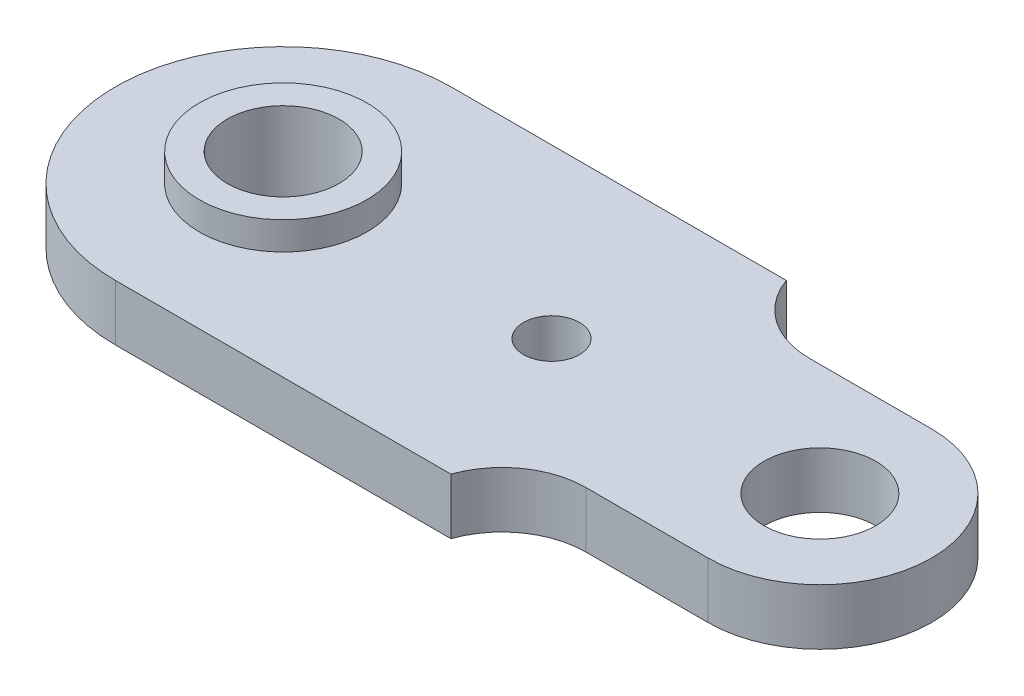
ISO-10303-21;
HEADER;
FILE_DESCRIPTION(('STEP AP214'),'2;1');
FILE_NAME('part.step','',(''),(''),'','','');
FILE_SCHEMA(('AUTOMOTIVE_DESIGN { 1 0 10303 214 1 1 1 1 }'));
ENDSEC;
DATA;
#1=APPLICATION_CONTEXT('core data for automotive mechanical design processes');
#2=APPLICATION_PROTOCOL_DEFINITION('international standard','automotive_design',2000,#1);
#3=PRODUCT_CONTEXT('',#1,'mechanical');
#4=PRODUCT('Part','Part','',(#3));
#5=PRODUCT_RELATED_PRODUCT_CATEGORY('part','',(#4));
#6=PRODUCT_DEFINITION_FORMATION('','',#4);
#7=PRODUCT_DEFINITION_CONTEXT('part definition',#1,'design');
#8=PRODUCT_DEFINITION('design','',#6,#7);
#9=PRODUCT_DEFINITION_SHAPE('','',#8);
#10=(LENGTH_UNIT() NAMED_UNIT(*) SI_UNIT(.MILLI.,.METRE.));
#11=(NAMED_UNIT(*) PLANE_ANGLE_UNIT() SI_UNIT($,.RADIAN.));
#12=(NAMED_UNIT(*) SI_UNIT($,.STERADIAN.) SOLID_ANGLE_UNIT());
#13=UNCERTAINTY_MEASURE_WITH_UNIT(LENGTH_MEASURE(1.E-05),#10,'distance_accuracy_value','');
#14=(GEOMETRIC_REPRESENTATION_CONTEXT(3) GLOBAL_UNCERTAINTY_ASSIGNED_CONTEXT((#13)) GLOBAL_UNIT_ASSIGNED_CONTEXT((#10,
#11,#12)) REPRESENTATION_CONTEXT('',''));
#15=CARTESIAN_POINT('',(0.,0.,0.));
#16=DIRECTION('',(0.,0.,1.));
#17=DIRECTION('',(1.,0.,0.));
#18=AXIS2_PLACEMENT_3D('',#15,#16,#17);
#19=CARTESIAN_POINT('',(0.,10.,0.));
#20=DIRECTION('',(0.,-1.,0.));
#21=DIRECTION('',(0.,0.,-1.));
#22=AXIS2_PLACEMENT_3D('',#19,#20,#21);
#23=CYLINDRICAL_SURFACE('',#22,30.);
#24=CARTESIAN_POINT('',(0.,0.,0.));
#25=DIRECTION('',(0.,1.,0.));
#26=DIRECTION('',(0.,0.,1.));
#27=AXIS2_PLACEMENT_3D('',#24,#25,#26);
#28=CIRCLE('',#27,30.);
#29=CARTESIAN_POINT('',(0.,0.,-30.));
#30=VERTEX_POINT('',#29);
#31=CARTESIAN_POINT('',(0.,0.,30.));
#32=VERTEX_POINT('',#31);
#33=EDGE_CURVE('E132',#30,#32,#28,.T.);
#34=ORIENTED_EDGE('',*,*,#33,.T.);
#35=DIRECTION('',(0.,-1.,0.));
#36=VECTOR('',#35,1.);
#37=CARTESIAN_POINT('',(0.,10.,30.));
#38=LINE('',#37,#36);
#39=CARTESIAN_POINT('',(0.,10.,30.));
#40=VERTEX_POINT('',#39);
#41=EDGE_CURVE('E11',#40,#32,#38,.T.);
#42=ORIENTED_EDGE('',*,*,#41,.F.);
#43=CARTESIAN_POINT('',(0.,10.,0.));
#44=DIRECTION('',(0.,1.,0.));
#45=DIRECTION('',(0.,0.,1.));
#46=AXIS2_PLACEMENT_3D('',#43,#44,#45);
#47=CIRCLE('',#46,30.);
#48=CARTESIAN_POINT('',(0.,10.,-30.));
#49=VERTEX_POINT('',#48);
#50=EDGE_CURVE('E151',#49,#40,#47,.T.);
#51=ORIENTED_EDGE('',*,*,#50,.F.);
#52=DIRECTION('',(0.,-1.,0.));
#53=VECTOR('',#52,1.);
#54=CARTESIAN_POINT('',(0.,10.,-30.));
#55=LINE('',#54,#53);
#56=EDGE_CURVE('E51',#49,#30,#55,.T.);
#57=ORIENTED_EDGE('',*,*,#56,.T.);
#58=EDGE_LOOP('',(#34,#42,#51,#57));
#59=FACE_BOUND('',#58,.T.);
#60=ADVANCED_FACE('F35',(#59),#23,.T.);
#61=CARTESIAN_POINT('',(0.,10.,30.));
#62=DIRECTION('',(0.,0.,-1.));
#63=DIRECTION('',(-1.,0.,0.));
#64=AXIS2_PLACEMENT_3D('',#61,#62,#63);
#65=PLANE('',#64);
#66=DIRECTION('',(1.,0.,0.));
#67=VECTOR('',#66,1.);
#68=CARTESIAN_POINT('',(0.,0.,30.));
#69=LINE('',#68,#67);
#70=CARTESIAN_POINT('',(60.,0.,30.));
#71=VERTEX_POINT('',#70);
#72=EDGE_CURVE('E134',#32,#71,#69,.T.);
#73=ORIENTED_EDGE('',*,*,#72,.T.);
#74=DIRECTION('',(0.,-1.,0.));
#75=VECTOR('',#74,1.);
#76=CARTESIAN_POINT('',(60.,10.,30.));
#77=LINE('',#76,#75);
#78=CARTESIAN_POINT('',(60.,10.,30.));
#79=VERTEX_POINT('',#78);
#80=EDGE_CURVE('E43',#79,#71,#77,.T.);
#81=ORIENTED_EDGE('',*,*,#80,.F.);
#82=DIRECTION('',(1.,0.,0.));
#83=VECTOR('',#82,1.);
#84=CARTESIAN_POINT('',(0.,10.,30.));
#85=LINE('',#84,#83);
#86=EDGE_CURVE('E89',#40,#79,#85,.T.);
#87=ORIENTED_EDGE('',*,*,#86,.F.);
#88=ORIENTED_EDGE('',*,*,#41,.T.);
#89=EDGE_LOOP('',(#73,#81,#87,#88));
#90=FACE_BOUND('',#89,.T.);
#91=ADVANCED_FACE('F165',(#90),#65,.F.);
#92=CARTESIAN_POINT('',(74.1421356237309,10.,35.));
#93=DIRECTION('',(0.,-1.,0.));
#94=DIRECTION('',(0.,0.,-1.));
#95=AXIS2_PLACEMENT_3D('',#92,#93,#94);
#96=CYLINDRICAL_SURFACE('',#95,15.);
#97=CARTESIAN_POINT('',(74.1421356237309,0.,35.));
#98=DIRECTION('',(0.,1.,0.));
#99=DIRECTION('',(0.,0.,1.));
#100=AXIS2_PLACEMENT_3D('',#97,#98,#99);
#101=CIRCLE('',#100,15.);
#102=CARTESIAN_POINT('',(74.1421356237309,0.,20.));
#103=VERTEX_POINT('',#102);
#104=EDGE_CURVE('E138',#103,#71,#101,.T.);
#105=ORIENTED_EDGE('',*,*,#104,.F.);
#106=DIRECTION('',(0.,-1.,0.));
#107=VECTOR('',#106,1.);
#108=CARTESIAN_POINT('',(74.1421356237309,10.,20.));
#109=LINE('',#108,#107);
#110=CARTESIAN_POINT('',(74.1421356237309,10.,20.));
#111=VERTEX_POINT('',#110);
#112=EDGE_CURVE('E158',#111,#103,#109,.T.);
#113=ORIENTED_EDGE('',*,*,#112,.F.);
#114=CARTESIAN_POINT('',(74.1421356237309,10.,35.));
#115=DIRECTION('',(0.,1.,0.));
#116=DIRECTION('',(0.,0.,1.));
#117=AXIS2_PLACEMENT_3D('',#114,#115,#116);
#118=CIRCLE('',#117,15.);
#119=EDGE_CURVE('E164',#111,#79,#118,.T.);
#120=ORIENTED_EDGE('',*,*,#119,.T.);
#121=ORIENTED_EDGE('',*,*,#80,.T.);
#122=EDGE_LOOP('',(#105,#113,#120,#121));
#123=FACE_BOUND('',#122,.T.);
#124=ADVANCED_FACE('F162',(#123),#96,.F.);
#125=CARTESIAN_POINT('',(0.,10.,20.));
#126=DIRECTION('',(0.,0.,-1.));
#127=DIRECTION('',(-1.,0.,0.));
#128=AXIS2_PLACEMENT_3D('',#125,#126,#127);
#129=PLANE('',#128);
#130=DIRECTION('',(1.,0.,0.));
#131=VECTOR('',#130,1.);
#132=CARTESIAN_POINT('',(0.,0.,20.));
#133=LINE('',#132,#131);
#134=CARTESIAN_POINT('',(96.,0.,20.));
#135=VERTEX_POINT('',#134);
#136=EDGE_CURVE('E141',#103,#135,#133,.T.);
#137=ORIENTED_EDGE('',*,*,#136,.T.);
#138=DIRECTION('',(0.,-1.,0.));
#139=VECTOR('',#138,1.);
#140=CARTESIAN_POINT('',(96.,10.,20.));
#141=LINE('',#140,#139);
#142=CARTESIAN_POINT('',(96.,10.,20.));
#143=VERTEX_POINT('',#142);
#144=EDGE_CURVE('E155',#143,#135,#141,.T.);
#145=ORIENTED_EDGE('',*,*,#144,.F.);
#146=DIRECTION('',(1.,0.,0.));
#147=VECTOR('',#146,1.);
#148=CARTESIAN_POINT('',(0.,10.,20.));
#149=LINE('',#148,#147);
#150=EDGE_CURVE('E177',#111,#143,#149,.T.);
#151=ORIENTED_EDGE('',*,*,#150,.F.);
#152=ORIENTED_EDGE('',*,*,#112,.T.);
#153=EDGE_LOOP('',(#137,#145,#151,#152));
#154=FACE_BOUND('',#153,.T.);
#155=ADVANCED_FACE('F173',(#154),#129,.F.);
#156=CARTESIAN_POINT('',(96.,10.,0.));
#157=DIRECTION('',(0.,-1.,0.));
#158=DIRECTION('',(0.,0.,-1.));
#159=AXIS2_PLACEMENT_3D('',#156,#157,#158);
#160=CYLINDRICAL_SURFACE('',#159,20.);
#161=CARTESIAN_POINT('',(96.,0.,0.));
#162=DIRECTION('',(0.,1.,0.));
#163=DIRECTION('',(0.,0.,1.));
#164=AXIS2_PLACEMENT_3D('',#161,#162,#163);
#165=CIRCLE('',#164,20.);
#166=CARTESIAN_POINT('',(96.,0.,-20.));
#167=VERTEX_POINT('',#166);
#168=EDGE_CURVE('E143',#135,#167,#165,.T.);
#169=ORIENTED_EDGE('',*,*,#168,.T.);
#170=DIRECTION('',(0.,-1.,0.));
#171=VECTOR('',#170,1.);
#172=CARTESIAN_POINT('',(96.,10.,-20.));
#173=LINE('',#172,#171);
#174=CARTESIAN_POINT('',(96.,10.,-20.));
#175=VERTEX_POINT('',#174);
#176=EDGE_CURVE('E124',#175,#167,#173,.T.);
#177=ORIENTED_EDGE('',*,*,#176,.F.);
#178=CARTESIAN_POINT('',(96.,10.,0.));
#179=DIRECTION('',(0.,1.,0.));
#180=DIRECTION('',(0.,0.,1.));
#181=AXIS2_PLACEMENT_3D('',#178,#179,#180);
#182=CIRCLE('',#181,20.);
#183=EDGE_CURVE('E112',#143,#175,#182,.T.);
#184=ORIENTED_EDGE('',*,*,#183,.F.);
#185=ORIENTED_EDGE('',*,*,#144,.T.);
#186=EDGE_LOOP('',(#169,#177,#184,#185));
#187=FACE_BOUND('',#186,.T.);
#188=ADVANCED_FACE('F176',(#187),#160,.T.);
#189=CARTESIAN_POINT('',(0.,10.,-20.));
#190=DIRECTION('',(0.,0.,1.));
#191=DIRECTION('',(1.,0.,0.));
#192=AXIS2_PLACEMENT_3D('',#189,#190,#191);
#193=PLANE('',#192);
#194=DIRECTION('',(-1.,0.,0.));
#195=VECTOR('',#194,1.);
#196=CARTESIAN_POINT('',(0.,0.,-20.));
#197=LINE('',#196,#195);
#198=CARTESIAN_POINT('',(74.142135623731,0.,-20.));
#199=VERTEX_POINT('',#198);
#200=EDGE_CURVE('E121',#167,#199,#197,.T.);
#201=ORIENTED_EDGE('',*,*,#200,.T.);
#202=DIRECTION('',(0.,-1.,0.));
#203=VECTOR('',#202,1.);
#204=CARTESIAN_POINT('',(74.142135623731,10.,-20.));
#205=LINE('',#204,#203);
#206=CARTESIAN_POINT('',(74.142135623731,10.,-20.));
#207=VERTEX_POINT('',#206);
#208=EDGE_CURVE('E118',#207,#199,#205,.T.);
#209=ORIENTED_EDGE('',*,*,#208,.F.);
#210=DIRECTION('',(-1.,0.,0.));
#211=VECTOR('',#210,1.);
#212=CARTESIAN_POINT('',(0.,10.,-20.));
#213=LINE('',#212,#211);
#214=EDGE_CURVE('E105',#175,#207,#213,.T.);
#215=ORIENTED_EDGE('',*,*,#214,.F.);
#216=ORIENTED_EDGE('',*,*,#176,.T.);
#217=EDGE_LOOP('',(#201,#209,#215,#216));
#218=FACE_BOUND('',#217,.T.);
#219=ADVANCED_FACE('F119',(#218),#193,.F.);
#220=CARTESIAN_POINT('',(74.142135623731,10.,-35.));
#221=DIRECTION('',(0.,-1.,0.));
#222=DIRECTION('',(0.,0.,-1.));
#223=AXIS2_PLACEMENT_3D('',#220,#221,#222);
#224=CYLINDRICAL_SURFACE('',#223,15.);
#225=CARTESIAN_POINT('',(74.142135623731,0.,-35.));
#226=DIRECTION('',(0.,1.,0.));
#227=DIRECTION('',(0.,0.,1.));
#228=AXIS2_PLACEMENT_3D('',#225,#226,#227);
#229=CIRCLE('',#228,15.);
#230=CARTESIAN_POINT('',(60.,0.,-30.));
#231=VERTEX_POINT('',#230);
#232=EDGE_CURVE('E146',#231,#199,#229,.T.);
#233=ORIENTED_EDGE('',*,*,#232,.F.);
#234=DIRECTION('',(0.,-1.,0.));
#235=VECTOR('',#234,1.);
#236=CARTESIAN_POINT('',(60.,10.,-30.));
#237=LINE('',#236,#235);
#238=CARTESIAN_POINT('',(60.,10.,-30.));
#239=VERTEX_POINT('',#238);
#240=EDGE_CURVE('E77',#239,#231,#237,.T.);
#241=ORIENTED_EDGE('',*,*,#240,.F.);
#242=CARTESIAN_POINT('',(74.142135623731,10.,-35.));
#243=DIRECTION('',(0.,1.,0.));
#244=DIRECTION('',(0.,0.,1.));
#245=AXIS2_PLACEMENT_3D('',#242,#243,#244);
#246=CIRCLE('',#245,15.);
#247=EDGE_CURVE('E110',#239,#207,#246,.T.);
#248=ORIENTED_EDGE('',*,*,#247,.T.);
#249=ORIENTED_EDGE('',*,*,#208,.T.);
#250=EDGE_LOOP('',(#233,#241,#248,#249));
#251=FACE_BOUND('',#250,.T.);
#252=ADVANCED_FACE('F126',(#251),#224,.F.);
#253=CARTESIAN_POINT('',(0.,10.,-30.));
#254=DIRECTION('',(0.,0.,-1.));
#255=DIRECTION('',(-1.,0.,0.));
#256=AXIS2_PLACEMENT_3D('',#253,#254,#255);
#257=PLANE('',#256);
#258=DIRECTION('',(1.,0.,0.));
#259=VECTOR('',#258,1.);
#260=CARTESIAN_POINT('',(0.,0.,-30.));
#261=LINE('',#260,#259);
#262=EDGE_CURVE('E148',#30,#231,#261,.T.);
#263=ORIENTED_EDGE('',*,*,#262,.F.);
#264=ORIENTED_EDGE('',*,*,#56,.F.);
#265=DIRECTION('',(1.,0.,0.));
#266=VECTOR('',#265,1.);
#267=CARTESIAN_POINT('',(0.,10.,-30.));
#268=LINE('',#267,#266);
#269=EDGE_CURVE('E127',#49,#239,#268,.T.);
#270=ORIENTED_EDGE('',*,*,#269,.T.);
#271=ORIENTED_EDGE('',*,*,#240,.T.);
#272=EDGE_LOOP('',(#263,#264,#270,#271));
#273=FACE_BOUND('',#272,.T.);
#274=ADVANCED_FACE('F218',(#273),#257,.T.);
#275=CARTESIAN_POINT('',(0.,10.,0.));
#276=DIRECTION('',(0.,1.,0.));
#277=DIRECTION('',(0.,0.,1.));
#278=AXIS2_PLACEMENT_3D('',#275,#276,#277);
#279=PLANE('',#278);
#280=CARTESIAN_POINT('',(96.,10.,0.));
#281=DIRECTION('',(0.,1.,0.));
#282=DIRECTION('',(0.,0.,1.));
#283=AXIS2_PLACEMENT_3D('',#280,#281,#282);
#284=CIRCLE('',#283,9.99999999999999);
#285=CARTESIAN_POINT('',(96.,10.,10.));
#286=VERTEX_POINT('',#285);
#287=EDGE_CURVE('E201',#286,#286,#284,.T.);
#288=ORIENTED_EDGE('',*,*,#287,.F.);
#289=EDGE_LOOP('',(#288));
#290=FACE_BOUND('',#289,.T.);
#291=CARTESIAN_POINT('',(48.,10.,0.));
#292=DIRECTION('',(0.,1.,0.));
#293=DIRECTION('',(0.,0.,1.));
#294=AXIS2_PLACEMENT_3D('',#291,#292,#293);
#295=CIRCLE('',#294,5.);
#296=CARTESIAN_POINT('',(48.,10.,5.));
#297=VERTEX_POINT('',#296);
#298=EDGE_CURVE('E195',#297,#297,#295,.T.);
#299=ORIENTED_EDGE('',*,*,#298,.F.);
#300=EDGE_LOOP('',(#299));
#301=FACE_BOUND('',#300,.T.);
#302=CARTESIAN_POINT('',(0.,10.,0.));
#303=DIRECTION('',(0.,1.,0.));
#304=DIRECTION('',(0.,0.,1.));
#305=AXIS2_PLACEMENT_3D('',#302,#303,#304);
#306=CIRCLE('',#305,15.);
#307=CARTESIAN_POINT('',(0.,10.,15.));
#308=VERTEX_POINT('',#307);
#309=EDGE_CURVE('E183',#308,#308,#306,.T.);
#310=ORIENTED_EDGE('',*,*,#309,.F.);
#311=EDGE_LOOP('',(#310));
#312=FACE_BOUND('',#311,.T.);
#313=ORIENTED_EDGE('',*,*,#50,.T.);
#314=ORIENTED_EDGE('',*,*,#86,.T.);
#315=ORIENTED_EDGE('',*,*,#119,.F.);
#316=ORIENTED_EDGE('',*,*,#150,.T.);
#317=ORIENTED_EDGE('',*,*,#183,.T.);
#318=ORIENTED_EDGE('',*,*,#214,.T.);
#319=ORIENTED_EDGE('',*,*,#247,.F.);
#320=ORIENTED_EDGE('',*,*,#269,.F.);
#321=EDGE_LOOP('',(#313,#314,#315,#316,#317,#318,#319,#320));
#322=FACE_BOUND('',#321,.T.);
#323=ADVANCED_FACE('F107',(#290,#301,#312,#322),#279,.T.);
#324=CARTESIAN_POINT('',(0.,0.,0.));
#325=DIRECTION('',(0.,1.,0.));
#326=DIRECTION('',(0.,0.,1.));
#327=AXIS2_PLACEMENT_3D('',#324,#325,#326);
#328=PLANE('',#327);
#329=CARTESIAN_POINT('',(96.,0.,0.));
#330=DIRECTION('',(0.,1.,0.));
#331=DIRECTION('',(0.,0.,1.));
#332=AXIS2_PLACEMENT_3D('',#329,#330,#331);
#333=CIRCLE('',#332,9.99999999999999);
#334=CARTESIAN_POINT('',(96.,0.,10.));
#335=VERTEX_POINT('',#334);
#336=EDGE_CURVE('E198',#335,#335,#333,.T.);
#337=ORIENTED_EDGE('',*,*,#336,.T.);
#338=EDGE_LOOP('',(#337));
#339=FACE_BOUND('',#338,.T.);
#340=CARTESIAN_POINT('',(48.,0.,0.));
#341=DIRECTION('',(0.,1.,0.));
#342=DIRECTION('',(0.,0.,1.));
#343=AXIS2_PLACEMENT_3D('',#340,#341,#342);
#344=CIRCLE('',#343,5.);
#345=CARTESIAN_POINT('',(48.,0.,5.));
#346=VERTEX_POINT('',#345);
#347=EDGE_CURVE('E192',#346,#346,#344,.T.);
#348=ORIENTED_EDGE('',*,*,#347,.T.);
#349=EDGE_LOOP('',(#348));
#350=FACE_BOUND('',#349,.T.);
#351=CARTESIAN_POINT('',(0.,0.,0.));
#352=DIRECTION('',(0.,1.,0.));
#353=DIRECTION('',(0.,0.,1.));
#354=AXIS2_PLACEMENT_3D('',#351,#352,#353);
#355=CIRCLE('',#354,10.);
#356=CARTESIAN_POINT('',(0.,0.,10.));
#357=VERTEX_POINT('',#356);
#358=EDGE_CURVE('E186',#357,#357,#355,.T.);
#359=ORIENTED_EDGE('',*,*,#358,.T.);
#360=EDGE_LOOP('',(#359));
#361=FACE_BOUND('',#360,.T.);
#362=ORIENTED_EDGE('',*,*,#33,.F.);
#363=ORIENTED_EDGE('',*,*,#262,.T.);
#364=ORIENTED_EDGE('',*,*,#232,.T.);
#365=ORIENTED_EDGE('',*,*,#200,.F.);
#366=ORIENTED_EDGE('',*,*,#168,.F.);
#367=ORIENTED_EDGE('',*,*,#136,.F.);
#368=ORIENTED_EDGE('',*,*,#104,.T.);
#369=ORIENTED_EDGE('',*,*,#72,.F.);
#370=EDGE_LOOP('',(#362,#363,#364,#365,#366,#367,#368,#369));
#371=FACE_BOUND('',#370,.T.);
#372=ADVANCED_FACE('F169',(#339,#350,#361,#371),#328,.F.);
#373=CARTESIAN_POINT('',(0.,15.,0.));
#374=DIRECTION('',(0.,-1.,0.));
#375=DIRECTION('',(0.,0.,-1.));
#376=AXIS2_PLACEMENT_3D('',#373,#374,#375);
#377=CYLINDRICAL_SURFACE('',#376,15.);
#378=CARTESIAN_POINT('',(0.,15.,0.));
#379=DIRECTION('',(0.,1.,0.));
#380=DIRECTION('',(0.,0.,1.));
#381=AXIS2_PLACEMENT_3D('',#378,#379,#380);
#382=CIRCLE('',#381,15.);
#383=CARTESIAN_POINT('',(0.,15.,15.));
#384=VERTEX_POINT('',#383);
#385=EDGE_CURVE('E135',#384,#384,#382,.T.);
#386=ORIENTED_EDGE('',*,*,#385,.F.);
#387=EDGE_LOOP('',(#386));
#388=FACE_BOUND('',#387,.T.);
#389=ORIENTED_EDGE('',*,*,#309,.T.);
#390=EDGE_LOOP('',(#389));
#391=FACE_BOUND('',#390,.T.);
#392=ADVANCED_FACE('F224',(#388,#391),#377,.T.);
#393=CARTESIAN_POINT('',(0.,15.,0.));
#394=DIRECTION('',(0.,1.,0.));
#395=DIRECTION('',(0.,0.,1.));
#396=AXIS2_PLACEMENT_3D('',#393,#394,#395);
#397=PLANE('',#396);
#398=CARTESIAN_POINT('',(0.,15.,0.));
#399=DIRECTION('',(0.,1.,0.));
#400=DIRECTION('',(0.,0.,1.));
#401=AXIS2_PLACEMENT_3D('',#398,#399,#400);
#402=CIRCLE('',#401,10.);
#403=CARTESIAN_POINT('',(0.,15.,10.));
#404=VERTEX_POINT('',#403);
#405=EDGE_CURVE('E189',#404,#404,#402,.T.);
#406=ORIENTED_EDGE('',*,*,#405,.F.);
#407=EDGE_LOOP('',(#406));
#408=FACE_BOUND('',#407,.T.);
#409=ORIENTED_EDGE('',*,*,#385,.T.);
#410=EDGE_LOOP('',(#409));
#411=FACE_BOUND('',#410,.T.);
#412=ADVANCED_FACE('F226',(#408,#411),#397,.T.);
#413=CARTESIAN_POINT('',(0.,0.,0.));
#414=DIRECTION('',(0.,1.,0.));
#415=DIRECTION('',(0.,0.,1.));
#416=AXIS2_PLACEMENT_3D('',#413,#414,#415);
#417=CYLINDRICAL_SURFACE('',#416,10.);
#418=ORIENTED_EDGE('',*,*,#358,.F.);
#419=EDGE_LOOP('',(#418));
#420=FACE_BOUND('',#419,.T.);
#421=ORIENTED_EDGE('',*,*,#405,.T.);
#422=EDGE_LOOP('',(#421));
#423=FACE_BOUND('',#422,.T.);
#424=ADVANCED_FACE('F233',(#420,#423),#417,.F.);
#425=CARTESIAN_POINT('',(48.,0.,0.));
#426=DIRECTION('',(0.,1.,0.));
#427=DIRECTION('',(0.,0.,1.));
#428=AXIS2_PLACEMENT_3D('',#425,#426,#427);
#429=CYLINDRICAL_SURFACE('',#428,5.);
#430=ORIENTED_EDGE('',*,*,#347,.F.);
#431=EDGE_LOOP('',(#430));
#432=FACE_BOUND('',#431,.T.);
#433=ORIENTED_EDGE('',*,*,#298,.T.);
#434=EDGE_LOOP('',(#433));
#435=FACE_BOUND('',#434,.T.);
#436=ADVANCED_FACE('F212',(#432,#435),#429,.F.);
#437=CARTESIAN_POINT('',(96.,0.,0.));
#438=DIRECTION('',(0.,1.,0.));
#439=DIRECTION('',(0.,0.,1.));
#440=AXIS2_PLACEMENT_3D('',#437,#438,#439);
#441=CYLINDRICAL_SURFACE('',#440,9.99999999999999);
#442=ORIENTED_EDGE('',*,*,#336,.F.);
#443=EDGE_LOOP('',(#442));
#444=FACE_BOUND('',#443,.T.);
#445=ORIENTED_EDGE('',*,*,#287,.T.);
#446=EDGE_LOOP('',(#445));
#447=FACE_BOUND('',#446,.T.);
#448=ADVANCED_FACE('F209',(#444,#447),#441,.F.);
#449=CLOSED_SHELL('',(#60,#91,#124,#155,#188,#219,#252,#274,#323,#372,#392,#412,#424,#436,#448));
#450=MANIFOLD_SOLID_BREP('B2',#449);
#451=ADVANCED_BREP_SHAPE_REPRESENTATION('',(#18,#450),#14);
#452=SHAPE_DEFINITION_REPRESENTATION(#9,#451);
ENDSEC;
END-ISO-10303-21;
